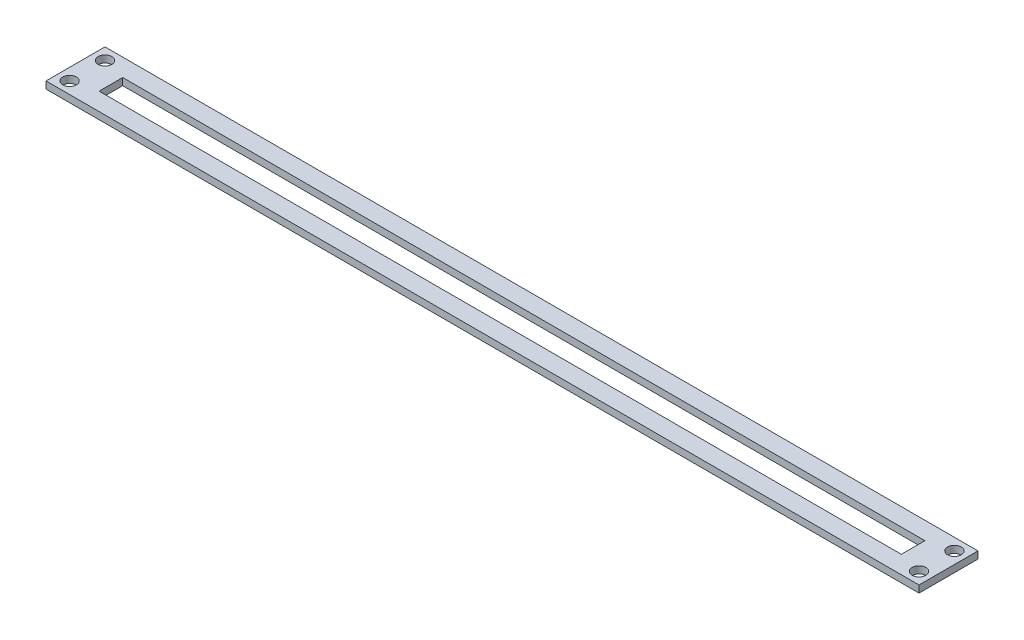
ISO-10303-21;
HEADER;
FILE_DESCRIPTION(('STEP AP214'),'2;1');
FILE_NAME('part.step','',(''),(''),'','','');
FILE_SCHEMA(('AUTOMOTIVE_DESIGN { 1 0 10303 214 1 1 1 1 }'));
ENDSEC;
DATA;
#1=APPLICATION_CONTEXT('core data for automotive mechanical design processes');
#2=APPLICATION_PROTOCOL_DEFINITION('international standard','automotive_design',2000,#1);
#3=PRODUCT_CONTEXT('',#1,'mechanical');
#4=PRODUCT('Part','Part','',(#3));
#5=PRODUCT_RELATED_PRODUCT_CATEGORY('part','',(#4));
#6=PRODUCT_DEFINITION_FORMATION('','',#4);
#7=PRODUCT_DEFINITION_CONTEXT('part definition',#1,'design');
#8=PRODUCT_DEFINITION('design','',#6,#7);
#9=PRODUCT_DEFINITION_SHAPE('','',#8);
#10=(LENGTH_UNIT() NAMED_UNIT(*) SI_UNIT(.MILLI.,.METRE.));
#11=(NAMED_UNIT(*) PLANE_ANGLE_UNIT() SI_UNIT($,.RADIAN.));
#12=(NAMED_UNIT(*) SI_UNIT($,.STERADIAN.) SOLID_ANGLE_UNIT());
#13=UNCERTAINTY_MEASURE_WITH_UNIT(LENGTH_MEASURE(1.E-05),#10,'distance_accuracy_value','');
#14=(GEOMETRIC_REPRESENTATION_CONTEXT(3) GLOBAL_UNCERTAINTY_ASSIGNED_CONTEXT((#13)) GLOBAL_UNIT_ASSIGNED_CONTEXT((#10,
#11,#12)) REPRESENTATION_CONTEXT('',''));
#15=CARTESIAN_POINT('',(0.,0.,0.));
#16=DIRECTION('',(0.,0.,1.));
#17=DIRECTION('',(1.,0.,0.));
#18=AXIS2_PLACEMENT_3D('',#15,#16,#17);
#19=CARTESIAN_POINT('',(0.,3.,0.));
#20=DIRECTION('',(0.,1.,0.));
#21=DIRECTION('',(0.,0.,1.));
#22=AXIS2_PLACEMENT_3D('',#19,#20,#21);
#23=PLANE('',#22);
#24=CARTESIAN_POINT('',(-180.,3.,-7.5));
#25=DIRECTION('',(0.,1.,0.));
#26=DIRECTION('',(0.,0.,1.));
#27=AXIS2_PLACEMENT_3D('',#24,#25,#26);
#28=CIRCLE('',#27,2.89999999999999);
#29=CARTESIAN_POINT('',(-180.,3.,-4.60000000000001));
#30=VERTEX_POINT('',#29);
#31=EDGE_CURVE('E194',#30,#30,#28,.T.);
#32=ORIENTED_EDGE('',*,*,#31,.F.);
#33=EDGE_LOOP('',(#32));
#34=FACE_BOUND('',#33,.T.);
#35=CARTESIAN_POINT('',(-180.,3.,7.50000000000001));
#36=DIRECTION('',(0.,1.,0.));
#37=DIRECTION('',(0.,0.,1.));
#38=AXIS2_PLACEMENT_3D('',#35,#36,#37);
#39=CIRCLE('',#38,2.89999999999999);
#40=CARTESIAN_POINT('',(-180.,3.,10.4));
#41=VERTEX_POINT('',#40);
#42=EDGE_CURVE('E188',#41,#41,#39,.T.);
#43=ORIENTED_EDGE('',*,*,#42,.F.);
#44=EDGE_LOOP('',(#43));
#45=FACE_BOUND('',#44,.T.);
#46=CARTESIAN_POINT('',(180.,3.,7.50000000000001));
#47=DIRECTION('',(0.,1.,0.));
#48=DIRECTION('',(0.,0.,1.));
#49=AXIS2_PLACEMENT_3D('',#46,#47,#48);
#50=CIRCLE('',#49,2.89999999999999);
#51=CARTESIAN_POINT('',(180.,3.,10.4));
#52=VERTEX_POINT('',#51);
#53=EDGE_CURVE('E181',#52,#52,#50,.T.);
#54=ORIENTED_EDGE('',*,*,#53,.F.);
#55=EDGE_LOOP('',(#54));
#56=FACE_BOUND('',#55,.T.);
#57=CARTESIAN_POINT('',(180.,3.,-7.5));
#58=DIRECTION('',(0.,1.,0.));
#59=DIRECTION('',(0.,0.,1.));
#60=AXIS2_PLACEMENT_3D('',#57,#58,#59);
#61=CIRCLE('',#60,2.89999999999999);
#62=CARTESIAN_POINT('',(180.,3.,-4.60000000000001));
#63=VERTEX_POINT('',#62);
#64=EDGE_CURVE('E174',#63,#63,#61,.T.);
#65=ORIENTED_EDGE('',*,*,#64,.F.);
#66=EDGE_LOOP('',(#65));
#67=FACE_BOUND('',#66,.T.);
#68=DIRECTION('',(0.,0.,-1.));
#69=VECTOR('',#68,1.);
#70=CARTESIAN_POINT('',(185.,3.,-12.5));
#71=LINE('',#70,#69);
#72=CARTESIAN_POINT('',(185.,3.,12.5));
#73=VERTEX_POINT('',#72);
#74=CARTESIAN_POINT('',(185.,3.,-12.5));
#75=VERTEX_POINT('',#74);
#76=EDGE_CURVE('E145',#73,#75,#71,.T.);
#77=ORIENTED_EDGE('',*,*,#76,.T.);
#78=DIRECTION('',(-1.,0.,0.));
#79=VECTOR('',#78,1.);
#80=CARTESIAN_POINT('',(-185.,3.,-12.5));
#81=LINE('',#80,#79);
#82=CARTESIAN_POINT('',(-185.,3.,-12.5));
#83=VERTEX_POINT('',#82);
#84=EDGE_CURVE('E148',#75,#83,#81,.T.);
#85=ORIENTED_EDGE('',*,*,#84,.T.);
#86=DIRECTION('',(0.,0.,1.));
#87=VECTOR('',#86,1.);
#88=CARTESIAN_POINT('',(-185.,3.,-12.5));
#89=LINE('',#88,#87);
#90=CARTESIAN_POINT('',(-185.,3.,12.5));
#91=VERTEX_POINT('',#90);
#92=EDGE_CURVE('E152',#83,#91,#89,.T.);
#93=ORIENTED_EDGE('',*,*,#92,.T.);
#94=DIRECTION('',(1.,0.,0.));
#95=VECTOR('',#94,1.);
#96=CARTESIAN_POINT('',(-185.,3.,12.5));
#97=LINE('',#96,#95);
#98=EDGE_CURVE('E154',#91,#73,#97,.T.);
#99=ORIENTED_EDGE('',*,*,#98,.T.);
#100=EDGE_LOOP('',(#77,#85,#93,#99));
#101=FACE_BOUND('',#100,.T.);
#102=DIRECTION('',(-1.,0.,0.));
#103=VECTOR('',#102,1.);
#104=CARTESIAN_POINT('',(-170.,3.,-5.00000000000001));
#105=LINE('',#104,#103);
#106=CARTESIAN_POINT('',(170.,3.,-5.00000000000001));
#107=VERTEX_POINT('',#106);
#108=CARTESIAN_POINT('',(-170.,3.,-5.00000000000001));
#109=VERTEX_POINT('',#108);
#110=EDGE_CURVE('E111',#107,#109,#105,.T.);
#111=ORIENTED_EDGE('',*,*,#110,.F.);
#112=DIRECTION('',(0.,0.,-1.));
#113=VECTOR('',#112,1.);
#114=CARTESIAN_POINT('',(170.,3.,-5.00000000000001));
#115=LINE('',#114,#113);
#116=CARTESIAN_POINT('',(170.,3.,4.99999999999999));
#117=VERTEX_POINT('',#116);
#118=EDGE_CURVE('E103',#117,#107,#115,.T.);
#119=ORIENTED_EDGE('',*,*,#118,.F.);
#120=DIRECTION('',(1.,0.,0.));
#121=VECTOR('',#120,1.);
#122=CARTESIAN_POINT('',(-170.,3.,4.99999999999999));
#123=LINE('',#122,#121);
#124=CARTESIAN_POINT('',(-170.,3.,4.99999999999999));
#125=VERTEX_POINT('',#124);
#126=EDGE_CURVE('E128',#125,#117,#123,.T.);
#127=ORIENTED_EDGE('',*,*,#126,.F.);
#128=DIRECTION('',(0.,0.,1.));
#129=VECTOR('',#128,1.);
#130=CARTESIAN_POINT('',(-170.,3.,-5.00000000000001));
#131=LINE('',#130,#129);
#132=EDGE_CURVE('E123',#109,#125,#131,.T.);
#133=ORIENTED_EDGE('',*,*,#132,.F.);
#134=EDGE_LOOP('',(#111,#119,#127,#133));
#135=FACE_BOUND('',#134,.T.);
#136=ADVANCED_FACE('F36',(#34,#45,#56,#67,#101,#135),#23,.T.);
#137=CARTESIAN_POINT('',(0.,0.,0.));
#138=DIRECTION('',(0.,1.,0.));
#139=DIRECTION('',(0.,0.,1.));
#140=AXIS2_PLACEMENT_3D('',#137,#138,#139);
#141=PLANE('',#140);
#142=CARTESIAN_POINT('',(-180.,0.,-7.5));
#143=DIRECTION('',(0.,1.,0.));
#144=DIRECTION('',(0.,0.,1.));
#145=AXIS2_PLACEMENT_3D('',#142,#143,#144);
#146=CIRCLE('',#145,2.89999999999999);
#147=CARTESIAN_POINT('',(-180.,0.,-4.60000000000001));
#148=VERTEX_POINT('',#147);
#149=EDGE_CURVE('E191',#148,#148,#146,.T.);
#150=ORIENTED_EDGE('',*,*,#149,.T.);
#151=EDGE_LOOP('',(#150));
#152=FACE_BOUND('',#151,.T.);
#153=CARTESIAN_POINT('',(-180.,0.,7.50000000000001));
#154=DIRECTION('',(0.,1.,0.));
#155=DIRECTION('',(0.,0.,1.));
#156=AXIS2_PLACEMENT_3D('',#153,#154,#155);
#157=CIRCLE('',#156,2.89999999999999);
#158=CARTESIAN_POINT('',(-180.,0.,10.4));
#159=VERTEX_POINT('',#158);
#160=EDGE_CURVE('E185',#159,#159,#157,.T.);
#161=ORIENTED_EDGE('',*,*,#160,.T.);
#162=EDGE_LOOP('',(#161));
#163=FACE_BOUND('',#162,.T.);
#164=CARTESIAN_POINT('',(180.,0.,7.50000000000001));
#165=DIRECTION('',(0.,1.,0.));
#166=DIRECTION('',(0.,0.,1.));
#167=AXIS2_PLACEMENT_3D('',#164,#165,#166);
#168=CIRCLE('',#167,2.89999999999999);
#169=CARTESIAN_POINT('',(180.,0.,10.4));
#170=VERTEX_POINT('',#169);
#171=EDGE_CURVE('E40',#170,#170,#168,.T.);
#172=ORIENTED_EDGE('',*,*,#171,.T.);
#173=EDGE_LOOP('',(#172));
#174=FACE_BOUND('',#173,.T.);
#175=CARTESIAN_POINT('',(180.,0.,-7.5));
#176=DIRECTION('',(0.,1.,0.));
#177=DIRECTION('',(0.,0.,1.));
#178=AXIS2_PLACEMENT_3D('',#175,#176,#177);
#179=CIRCLE('',#178,2.89999999999999);
#180=CARTESIAN_POINT('',(180.,0.,-4.60000000000001));
#181=VERTEX_POINT('',#180);
#182=EDGE_CURVE('E135',#181,#181,#179,.T.);
#183=ORIENTED_EDGE('',*,*,#182,.T.);
#184=EDGE_LOOP('',(#183));
#185=FACE_BOUND('',#184,.T.);
#186=DIRECTION('',(0.,0.,-1.));
#187=VECTOR('',#186,1.);
#188=CARTESIAN_POINT('',(185.,0.,-12.5));
#189=LINE('',#188,#187);
#190=CARTESIAN_POINT('',(185.,0.,12.5));
#191=VERTEX_POINT('',#190);
#192=CARTESIAN_POINT('',(185.,0.,-12.5));
#193=VERTEX_POINT('',#192);
#194=EDGE_CURVE('E119',#191,#193,#189,.T.);
#195=ORIENTED_EDGE('',*,*,#194,.F.);
#196=DIRECTION('',(1.,0.,0.));
#197=VECTOR('',#196,1.);
#198=CARTESIAN_POINT('',(-185.,0.,12.5));
#199=LINE('',#198,#197);
#200=CARTESIAN_POINT('',(-185.,0.,12.5));
#201=VERTEX_POINT('',#200);
#202=EDGE_CURVE('E149',#201,#191,#199,.T.);
#203=ORIENTED_EDGE('',*,*,#202,.F.);
#204=DIRECTION('',(0.,0.,1.));
#205=VECTOR('',#204,1.);
#206=CARTESIAN_POINT('',(-185.,0.,-12.5));
#207=LINE('',#206,#205);
#208=CARTESIAN_POINT('',(-185.,0.,-12.5));
#209=VERTEX_POINT('',#208);
#210=EDGE_CURVE('E163',#209,#201,#207,.T.);
#211=ORIENTED_EDGE('',*,*,#210,.F.);
#212=DIRECTION('',(-1.,0.,0.));
#213=VECTOR('',#212,1.);
#214=CARTESIAN_POINT('',(-185.,0.,-12.5));
#215=LINE('',#214,#213);
#216=EDGE_CURVE('E160',#193,#209,#215,.T.);
#217=ORIENTED_EDGE('',*,*,#216,.F.);
#218=EDGE_LOOP('',(#195,#203,#211,#217));
#219=FACE_BOUND('',#218,.T.);
#220=DIRECTION('',(0.,0.,-1.));
#221=VECTOR('',#220,1.);
#222=CARTESIAN_POINT('',(170.,0.,-5.00000000000001));
#223=LINE('',#222,#221);
#224=CARTESIAN_POINT('',(170.,0.,4.99999999999999));
#225=VERTEX_POINT('',#224);
#226=CARTESIAN_POINT('',(170.,0.,-5.00000000000001));
#227=VERTEX_POINT('',#226);
#228=EDGE_CURVE('E61',#225,#227,#223,.T.);
#229=ORIENTED_EDGE('',*,*,#228,.T.);
#230=DIRECTION('',(-1.,0.,0.));
#231=VECTOR('',#230,1.);
#232=CARTESIAN_POINT('',(-170.,0.,-5.00000000000001));
#233=LINE('',#232,#231);
#234=CARTESIAN_POINT('',(-170.,0.,-5.00000000000001));
#235=VERTEX_POINT('',#234);
#236=EDGE_CURVE('E118',#227,#235,#233,.T.);
#237=ORIENTED_EDGE('',*,*,#236,.T.);
#238=DIRECTION('',(0.,0.,1.));
#239=VECTOR('',#238,1.);
#240=CARTESIAN_POINT('',(-170.,0.,-5.00000000000001));
#241=LINE('',#240,#239);
#242=CARTESIAN_POINT('',(-170.,0.,4.99999999999999));
#243=VERTEX_POINT('',#242);
#244=EDGE_CURVE('E137',#235,#243,#241,.T.);
#245=ORIENTED_EDGE('',*,*,#244,.T.);
#246=DIRECTION('',(1.,0.,0.));
#247=VECTOR('',#246,1.);
#248=CARTESIAN_POINT('',(-170.,0.,4.99999999999999));
#249=LINE('',#248,#247);
#250=EDGE_CURVE('E112',#243,#225,#249,.T.);
#251=ORIENTED_EDGE('',*,*,#250,.T.);
#252=EDGE_LOOP('',(#229,#237,#245,#251));
#253=FACE_BOUND('',#252,.T.);
#254=ADVANCED_FACE('F203',(#152,#163,#174,#185,#219,#253),#141,.F.);
#255=CARTESIAN_POINT('',(185.,3.,-12.5));
#256=DIRECTION('',(-1.,0.,0.));
#257=DIRECTION('',(0.,0.,1.));
#258=AXIS2_PLACEMENT_3D('',#255,#256,#257);
#259=PLANE('',#258);
#260=ORIENTED_EDGE('',*,*,#194,.T.);
#261=DIRECTION('',(0.,-1.,0.));
#262=VECTOR('',#261,1.);
#263=CARTESIAN_POINT('',(185.,3.,-12.5));
#264=LINE('',#263,#262);
#265=EDGE_CURVE('E11',#75,#193,#264,.T.);
#266=ORIENTED_EDGE('',*,*,#265,.F.);
#267=ORIENTED_EDGE('',*,*,#76,.F.);
#268=DIRECTION('',(0.,-1.,0.));
#269=VECTOR('',#268,1.);
#270=CARTESIAN_POINT('',(185.,3.,12.5));
#271=LINE('',#270,#269);
#272=EDGE_CURVE('E157',#73,#191,#271,.T.);
#273=ORIENTED_EDGE('',*,*,#272,.T.);
#274=EDGE_LOOP('',(#260,#266,#267,#273));
#275=FACE_BOUND('',#274,.T.);
#276=ADVANCED_FACE('F38',(#275),#259,.F.);
#277=CARTESIAN_POINT('',(-185.,3.,-12.5));
#278=DIRECTION('',(0.,0.,1.));
#279=DIRECTION('',(1.,0.,0.));
#280=AXIS2_PLACEMENT_3D('',#277,#278,#279);
#281=PLANE('',#280);
#282=ORIENTED_EDGE('',*,*,#216,.T.);
#283=DIRECTION('',(0.,-1.,0.));
#284=VECTOR('',#283,1.);
#285=CARTESIAN_POINT('',(-185.,3.,-12.5));
#286=LINE('',#285,#284);
#287=EDGE_CURVE('E45',#83,#209,#286,.T.);
#288=ORIENTED_EDGE('',*,*,#287,.F.);
#289=ORIENTED_EDGE('',*,*,#84,.F.);
#290=ORIENTED_EDGE('',*,*,#265,.T.);
#291=EDGE_LOOP('',(#282,#288,#289,#290));
#292=FACE_BOUND('',#291,.T.);
#293=ADVANCED_FACE('F218',(#292),#281,.F.);
#294=CARTESIAN_POINT('',(-185.,3.,-12.5));
#295=DIRECTION('',(1.,0.,0.));
#296=DIRECTION('',(0.,0.,-1.));
#297=AXIS2_PLACEMENT_3D('',#294,#295,#296);
#298=PLANE('',#297);
#299=ORIENTED_EDGE('',*,*,#210,.T.);
#300=DIRECTION('',(0.,-1.,0.));
#301=VECTOR('',#300,1.);
#302=CARTESIAN_POINT('',(-185.,3.,12.5));
#303=LINE('',#302,#301);
#304=EDGE_CURVE('E169',#91,#201,#303,.T.);
#305=ORIENTED_EDGE('',*,*,#304,.F.);
#306=ORIENTED_EDGE('',*,*,#92,.F.);
#307=ORIENTED_EDGE('',*,*,#287,.T.);
#308=EDGE_LOOP('',(#299,#305,#306,#307));
#309=FACE_BOUND('',#308,.T.);
#310=ADVANCED_FACE('F223',(#309),#298,.F.);
#311=CARTESIAN_POINT('',(-185.,3.,12.5));
#312=DIRECTION('',(0.,0.,-1.));
#313=DIRECTION('',(-1.,0.,0.));
#314=AXIS2_PLACEMENT_3D('',#311,#312,#313);
#315=PLANE('',#314);
#316=ORIENTED_EDGE('',*,*,#202,.T.);
#317=ORIENTED_EDGE('',*,*,#272,.F.);
#318=ORIENTED_EDGE('',*,*,#98,.F.);
#319=ORIENTED_EDGE('',*,*,#304,.T.);
#320=EDGE_LOOP('',(#316,#317,#318,#319));
#321=FACE_BOUND('',#320,.T.);
#322=ADVANCED_FACE('F226',(#321),#315,.F.);
#323=CARTESIAN_POINT('',(170.,3.,-5.00000000000001));
#324=DIRECTION('',(-1.,0.,0.));
#325=DIRECTION('',(0.,0.,1.));
#326=AXIS2_PLACEMENT_3D('',#323,#324,#325);
#327=PLANE('',#326);
#328=ORIENTED_EDGE('',*,*,#228,.F.);
#329=DIRECTION('',(0.,-1.,0.));
#330=VECTOR('',#329,1.);
#331=CARTESIAN_POINT('',(170.,3.,4.99999999999999));
#332=LINE('',#331,#330);
#333=EDGE_CURVE('E107',#117,#225,#332,.T.);
#334=ORIENTED_EDGE('',*,*,#333,.F.);
#335=ORIENTED_EDGE('',*,*,#118,.T.);
#336=DIRECTION('',(0.,-1.,0.));
#337=VECTOR('',#336,1.);
#338=CARTESIAN_POINT('',(170.,3.,-5.00000000000001));
#339=LINE('',#338,#337);
#340=EDGE_CURVE('E106',#107,#227,#339,.T.);
#341=ORIENTED_EDGE('',*,*,#340,.T.);
#342=EDGE_LOOP('',(#328,#334,#335,#341));
#343=FACE_BOUND('',#342,.T.);
#344=ADVANCED_FACE('F105',(#343),#327,.T.);
#345=CARTESIAN_POINT('',(-170.,3.,-5.00000000000001));
#346=DIRECTION('',(0.,0.,1.));
#347=DIRECTION('',(1.,0.,0.));
#348=AXIS2_PLACEMENT_3D('',#345,#346,#347);
#349=PLANE('',#348);
#350=ORIENTED_EDGE('',*,*,#236,.F.);
#351=ORIENTED_EDGE('',*,*,#340,.F.);
#352=ORIENTED_EDGE('',*,*,#110,.T.);
#353=DIRECTION('',(0.,-1.,0.));
#354=VECTOR('',#353,1.);
#355=CARTESIAN_POINT('',(-170.,3.,-5.00000000000001));
#356=LINE('',#355,#354);
#357=EDGE_CURVE('E120',#109,#235,#356,.T.);
#358=ORIENTED_EDGE('',*,*,#357,.T.);
#359=EDGE_LOOP('',(#350,#351,#352,#358));
#360=FACE_BOUND('',#359,.T.);
#361=ADVANCED_FACE('F115',(#360),#349,.T.);
#362=CARTESIAN_POINT('',(-170.,3.,-5.00000000000001));
#363=DIRECTION('',(1.,0.,0.));
#364=DIRECTION('',(0.,0.,-1.));
#365=AXIS2_PLACEMENT_3D('',#362,#363,#364);
#366=PLANE('',#365);
#367=ORIENTED_EDGE('',*,*,#244,.F.);
#368=ORIENTED_EDGE('',*,*,#357,.F.);
#369=ORIENTED_EDGE('',*,*,#132,.T.);
#370=DIRECTION('',(0.,-1.,0.));
#371=VECTOR('',#370,1.);
#372=CARTESIAN_POINT('',(-170.,3.,4.99999999999999));
#373=LINE('',#372,#371);
#374=EDGE_CURVE('E53',#125,#243,#373,.T.);
#375=ORIENTED_EDGE('',*,*,#374,.T.);
#376=EDGE_LOOP('',(#367,#368,#369,#375));
#377=FACE_BOUND('',#376,.T.);
#378=ADVANCED_FACE('F236',(#377),#366,.T.);
#379=CARTESIAN_POINT('',(-170.,3.,4.99999999999999));
#380=DIRECTION('',(0.,0.,-1.));
#381=DIRECTION('',(-1.,0.,0.));
#382=AXIS2_PLACEMENT_3D('',#379,#380,#381);
#383=PLANE('',#382);
#384=ORIENTED_EDGE('',*,*,#250,.F.);
#385=ORIENTED_EDGE('',*,*,#374,.F.);
#386=ORIENTED_EDGE('',*,*,#126,.T.);
#387=ORIENTED_EDGE('',*,*,#333,.T.);
#388=EDGE_LOOP('',(#384,#385,#386,#387));
#389=FACE_BOUND('',#388,.T.);
#390=ADVANCED_FACE('F233',(#389),#383,.T.);
#391=CARTESIAN_POINT('',(180.,3.,-7.5));
#392=DIRECTION('',(0.,1.,0.));
#393=DIRECTION('',(0.,0.,1.));
#394=AXIS2_PLACEMENT_3D('',#391,#392,#393);
#395=CYLINDRICAL_SURFACE('',#394,2.89999999999999);
#396=ORIENTED_EDGE('',*,*,#64,.T.);
#397=EDGE_LOOP('',(#396));
#398=FACE_BOUND('',#397,.T.);
#399=ORIENTED_EDGE('',*,*,#182,.F.);
#400=EDGE_LOOP('',(#399));
#401=FACE_BOUND('',#400,.T.);
#402=ADVANCED_FACE('F235',(#398,#401),#395,.F.);
#403=CARTESIAN_POINT('',(180.,3.,7.50000000000001));
#404=DIRECTION('',(0.,1.,0.));
#405=DIRECTION('',(0.,0.,1.));
#406=AXIS2_PLACEMENT_3D('',#403,#404,#405);
#407=CYLINDRICAL_SURFACE('',#406,2.89999999999999);
#408=ORIENTED_EDGE('',*,*,#53,.T.);
#409=EDGE_LOOP('',(#408));
#410=FACE_BOUND('',#409,.T.);
#411=ORIENTED_EDGE('',*,*,#171,.F.);
#412=EDGE_LOOP('',(#411));
#413=FACE_BOUND('',#412,.T.);
#414=ADVANCED_FACE('F242',(#410,#413),#407,.F.);
#415=CARTESIAN_POINT('',(-180.,3.,7.50000000000001));
#416=DIRECTION('',(0.,1.,0.));
#417=DIRECTION('',(0.,0.,1.));
#418=AXIS2_PLACEMENT_3D('',#415,#416,#417);
#419=CYLINDRICAL_SURFACE('',#418,2.89999999999999);
#420=ORIENTED_EDGE('',*,*,#42,.T.);
#421=EDGE_LOOP('',(#420));
#422=FACE_BOUND('',#421,.T.);
#423=ORIENTED_EDGE('',*,*,#160,.F.);
#424=EDGE_LOOP('',(#423));
#425=FACE_BOUND('',#424,.T.);
#426=ADVANCED_FACE('F330',(#422,#425),#419,.F.);
#427=CARTESIAN_POINT('',(-180.,3.,-7.5));
#428=DIRECTION('',(0.,1.,0.));
#429=DIRECTION('',(0.,0.,1.));
#430=AXIS2_PLACEMENT_3D('',#427,#428,#429);
#431=CYLINDRICAL_SURFACE('',#430,2.89999999999999);
#432=ORIENTED_EDGE('',*,*,#31,.T.);
#433=EDGE_LOOP('',(#432));
#434=FACE_BOUND('',#433,.T.);
#435=ORIENTED_EDGE('',*,*,#149,.F.);
#436=EDGE_LOOP('',(#435));
#437=FACE_BOUND('',#436,.T.);
#438=ADVANCED_FACE('F198',(#434,#437),#431,.F.);
#439=CLOSED_SHELL('',(#136,#254,#276,#293,#310,#322,#344,#361,#378,#390,#402,#414,#426,#438));
#440=MANIFOLD_SOLID_BREP('B2',#439);
#441=ADVANCED_BREP_SHAPE_REPRESENTATION('',(#18,#440),#14);
#442=SHAPE_DEFINITION_REPRESENTATION(#9,#441);
ENDSEC;
END-ISO-10303-21;
